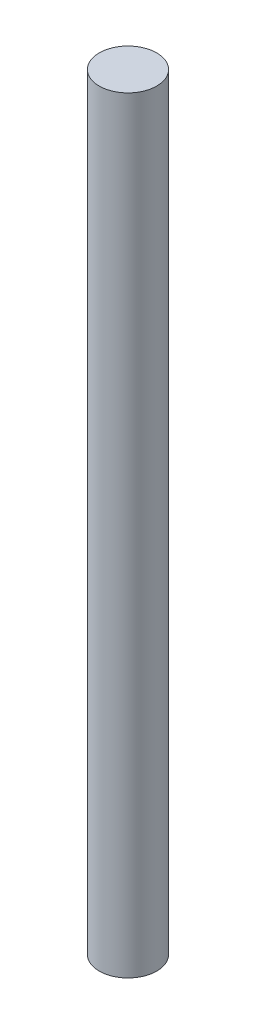
ISO-10303-21;
HEADER;
FILE_DESCRIPTION(('STEP AP214'),'2;1');
FILE_NAME('part.step','',(''),(''),'','','');
FILE_SCHEMA(('AUTOMOTIVE_DESIGN { 1 0 10303 214 1 1 1 1 }'));
ENDSEC;
DATA;
#1=APPLICATION_CONTEXT('core data for automotive mechanical design processes');
#2=APPLICATION_PROTOCOL_DEFINITION('international standard','automotive_design',2000,#1);
#3=PRODUCT_CONTEXT('',#1,'mechanical');
#4=PRODUCT('Part','Part','',(#3));
#5=PRODUCT_RELATED_PRODUCT_CATEGORY('part','',(#4));
#6=PRODUCT_DEFINITION_FORMATION('','',#4);
#7=PRODUCT_DEFINITION_CONTEXT('part definition',#1,'design');
#8=PRODUCT_DEFINITION('design','',#6,#7);
#9=PRODUCT_DEFINITION_SHAPE('','',#8);
#10=(LENGTH_UNIT() NAMED_UNIT(*) SI_UNIT(.MILLI.,.METRE.));
#11=(NAMED_UNIT(*) PLANE_ANGLE_UNIT() SI_UNIT($,.RADIAN.));
#12=(NAMED_UNIT(*) SI_UNIT($,.STERADIAN.) SOLID_ANGLE_UNIT());
#13=UNCERTAINTY_MEASURE_WITH_UNIT(LENGTH_MEASURE(1.E-05),#10,'distance_accuracy_value','');
#14=(GEOMETRIC_REPRESENTATION_CONTEXT(3) GLOBAL_UNCERTAINTY_ASSIGNED_CONTEXT((#13)) GLOBAL_UNIT_ASSIGNED_CONTEXT((#10,
#11,#12)) REPRESENTATION_CONTEXT('',''));
#15=CARTESIAN_POINT('',(0.,0.,0.));
#16=DIRECTION('',(0.,0.,1.));
#17=DIRECTION('',(1.,0.,0.));
#18=AXIS2_PLACEMENT_3D('',#15,#16,#17);
#19=CARTESIAN_POINT('',(0.,-10.,0.));
#20=DIRECTION('',(0.,1.,0.));
#21=DIRECTION('',(0.,0.,1.));
#22=AXIS2_PLACEMENT_3D('',#19,#20,#21);
#23=CYLINDRICAL_SURFACE('',#22,0.75);
#24=CARTESIAN_POINT('',(0.,-10.,0.));
#25=DIRECTION('',(0.,1.,0.));
#26=DIRECTION('',(0.,0.,1.));
#27=AXIS2_PLACEMENT_3D('',#24,#25,#26);
#28=CIRCLE('',#27,0.75);
#29=CARTESIAN_POINT('',(0.,-10.,0.75));
#30=VERTEX_POINT('',#29);
#31=EDGE_CURVE('E10',#30,#30,#28,.T.);
#32=ORIENTED_EDGE('',*,*,#31,.T.);
#33=EDGE_LOOP('',(#32));
#34=FACE_BOUND('',#33,.T.);
#35=CARTESIAN_POINT('',(0.,10.,0.));
#36=DIRECTION('',(0.,1.,0.));
#37=DIRECTION('',(0.,0.,1.));
#38=AXIS2_PLACEMENT_3D('',#35,#36,#37);
#39=CIRCLE('',#38,0.75);
#40=CARTESIAN_POINT('',(0.,10.,0.75));
#41=VERTEX_POINT('',#40);
#42=EDGE_CURVE('E37',#41,#41,#39,.T.);
#43=ORIENTED_EDGE('',*,*,#42,.F.);
#44=EDGE_LOOP('',(#43));
#45=FACE_BOUND('',#44,.T.);
#46=ADVANCED_FACE('F31',(#34,#45),#23,.T.);
#47=CARTESIAN_POINT('',(0.,-10.,0.));
#48=DIRECTION('',(0.,1.,0.));
#49=DIRECTION('',(0.,0.,1.));
#50=AXIS2_PLACEMENT_3D('',#47,#48,#49);
#51=PLANE('',#50);
#52=ORIENTED_EDGE('',*,*,#31,.F.);
#53=EDGE_LOOP('',(#52));
#54=FACE_BOUND('',#53,.T.);
#55=ADVANCED_FACE('F46',(#54),#51,.F.);
#56=CARTESIAN_POINT('',(0.,10.,0.));
#57=DIRECTION('',(0.,1.,0.));
#58=DIRECTION('',(0.,0.,1.));
#59=AXIS2_PLACEMENT_3D('',#56,#57,#58);
#60=PLANE('',#59);
#61=ORIENTED_EDGE('',*,*,#42,.T.);
#62=EDGE_LOOP('',(#61));
#63=FACE_BOUND('',#62,.T.);
#64=ADVANCED_FACE('F43',(#63),#60,.T.);
#65=CLOSED_SHELL('',(#46,#55,#64));
#66=MANIFOLD_SOLID_BREP('B2',#65);
#67=ADVANCED_BREP_SHAPE_REPRESENTATION('',(#18,#66),#14);
#68=SHAPE_DEFINITION_REPRESENTATION(#9,#67);
ENDSEC;
END-ISO-10303-21;
